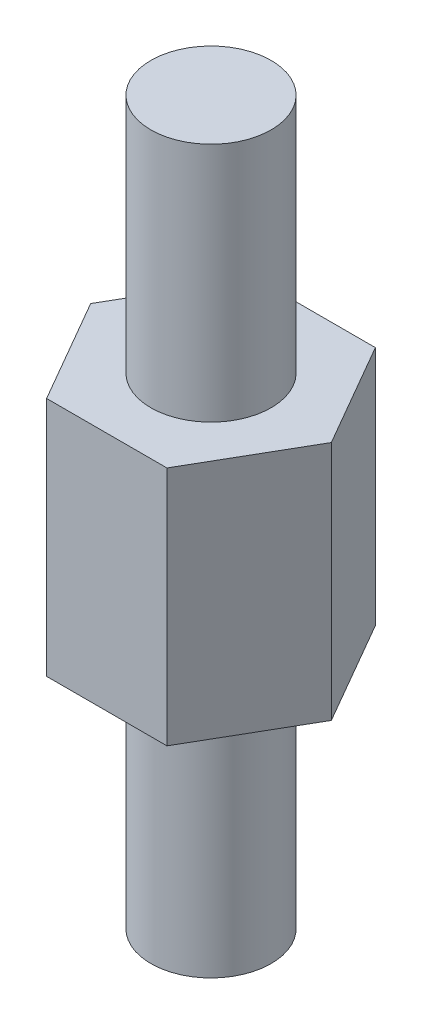
ISO-10303-21;
HEADER;
FILE_DESCRIPTION(('STEP AP214'),'2;1');
FILE_NAME('part.step','',(''),(''),'','','');
FILE_SCHEMA(('AUTOMOTIVE_DESIGN { 1 0 10303 214 1 1 1 1 }'));
ENDSEC;
DATA;
#1=APPLICATION_CONTEXT('core data for automotive mechanical design processes');
#2=APPLICATION_PROTOCOL_DEFINITION('international standard','automotive_design',2000,#1);
#3=PRODUCT_CONTEXT('',#1,'mechanical');
#4=PRODUCT('Part','Part','',(#3));
#5=PRODUCT_RELATED_PRODUCT_CATEGORY('part','',(#4));
#6=PRODUCT_DEFINITION_FORMATION('','',#4);
#7=PRODUCT_DEFINITION_CONTEXT('part definition',#1,'design');
#8=PRODUCT_DEFINITION('design','',#6,#7);
#9=PRODUCT_DEFINITION_SHAPE('','',#8);
#10=(LENGTH_UNIT() NAMED_UNIT(*) SI_UNIT(.MILLI.,.METRE.));
#11=(NAMED_UNIT(*) PLANE_ANGLE_UNIT() SI_UNIT($,.RADIAN.));
#12=(NAMED_UNIT(*) SI_UNIT($,.STERADIAN.) SOLID_ANGLE_UNIT());
#13=UNCERTAINTY_MEASURE_WITH_UNIT(LENGTH_MEASURE(1.E-05),#10,'distance_accuracy_value','');
#14=(GEOMETRIC_REPRESENTATION_CONTEXT(3) GLOBAL_UNCERTAINTY_ASSIGNED_CONTEXT((#13)) GLOBAL_UNIT_ASSIGNED_CONTEXT((#10,
#11,#12)) REPRESENTATION_CONTEXT('',''));
#15=CARTESIAN_POINT('',(0.,0.,0.));
#16=DIRECTION('',(0.,0.,1.));
#17=DIRECTION('',(1.,0.,0.));
#18=AXIS2_PLACEMENT_3D('',#15,#16,#17);
#19=CARTESIAN_POINT('',(1.5,6.,2.59807621135332));
#20=DIRECTION('',(-0.866025403784439,0.,-0.5));
#21=DIRECTION('',(-0.5,0.,0.866025403784439));
#22=AXIS2_PLACEMENT_3D('',#19,#20,#21);
#23=PLANE('',#22);
#24=DIRECTION('',(0.5,0.,-0.866025403784439));
#25=VECTOR('',#24,1.);
#26=CARTESIAN_POINT('',(1.5,0.,2.59807621135332));
#27=LINE('',#26,#25);
#28=CARTESIAN_POINT('',(1.5,0.,2.59807621135332));
#29=VERTEX_POINT('',#28);
#30=CARTESIAN_POINT('',(3.,0.,0.));
#31=VERTEX_POINT('',#30);
#32=EDGE_CURVE('E135',#29,#31,#27,.T.);
#33=ORIENTED_EDGE('',*,*,#32,.T.);
#34=DIRECTION('',(0.,-1.,0.));
#35=VECTOR('',#34,1.);
#36=CARTESIAN_POINT('',(3.,6.,0.));
#37=LINE('',#36,#35);
#38=CARTESIAN_POINT('',(3.,6.,0.));
#39=VERTEX_POINT('',#38);
#40=EDGE_CURVE('E46',#39,#31,#37,.T.);
#41=ORIENTED_EDGE('',*,*,#40,.F.);
#42=DIRECTION('',(0.5,0.,-0.866025403784439));
#43=VECTOR('',#42,1.);
#44=CARTESIAN_POINT('',(1.5,6.,2.59807621135332));
#45=LINE('',#44,#43);
#46=CARTESIAN_POINT('',(1.5,6.,2.59807621135332));
#47=VERTEX_POINT('',#46);
#48=EDGE_CURVE('E152',#47,#39,#45,.T.);
#49=ORIENTED_EDGE('',*,*,#48,.F.);
#50=DIRECTION('',(0.,-1.,0.));
#51=VECTOR('',#50,1.);
#52=CARTESIAN_POINT('',(1.5,6.,2.59807621135332));
#53=LINE('',#52,#51);
#54=EDGE_CURVE('E131',#47,#29,#53,.T.);
#55=ORIENTED_EDGE('',*,*,#54,.T.);
#56=EDGE_LOOP('',(#33,#41,#49,#55));
#57=FACE_BOUND('',#56,.T.);
#58=ADVANCED_FACE('F43',(#57),#23,.F.);
#59=CARTESIAN_POINT('',(3.,6.,0.));
#60=DIRECTION('',(-0.866025403784439,0.,0.5));
#61=DIRECTION('',(0.5,0.,0.866025403784439));
#62=AXIS2_PLACEMENT_3D('',#59,#60,#61);
#63=PLANE('',#62);
#64=DIRECTION('',(-0.5,0.,-0.866025403784439));
#65=VECTOR('',#64,1.);
#66=CARTESIAN_POINT('',(3.,0.,0.));
#67=LINE('',#66,#65);
#68=CARTESIAN_POINT('',(1.5,0.,-2.59807621135332));
#69=VERTEX_POINT('',#68);
#70=EDGE_CURVE('E139',#31,#69,#67,.T.);
#71=ORIENTED_EDGE('',*,*,#70,.T.);
#72=DIRECTION('',(0.,-1.,0.));
#73=VECTOR('',#72,1.);
#74=CARTESIAN_POINT('',(1.5,6.,-2.59807621135332));
#75=LINE('',#74,#73);
#76=CARTESIAN_POINT('',(1.5,6.,-2.59807621135332));
#77=VERTEX_POINT('',#76);
#78=EDGE_CURVE('E158',#77,#69,#75,.T.);
#79=ORIENTED_EDGE('',*,*,#78,.F.);
#80=DIRECTION('',(-0.5,0.,-0.866025403784439));
#81=VECTOR('',#80,1.);
#82=CARTESIAN_POINT('',(3.,6.,0.));
#83=LINE('',#82,#81);
#84=EDGE_CURVE('E100',#39,#77,#83,.T.);
#85=ORIENTED_EDGE('',*,*,#84,.F.);
#86=ORIENTED_EDGE('',*,*,#40,.T.);
#87=EDGE_LOOP('',(#71,#79,#85,#86));
#88=FACE_BOUND('',#87,.T.);
#89=ADVANCED_FACE('F212',(#88),#63,.F.);
#90=CARTESIAN_POINT('',(1.5,6.,-2.59807621135332));
#91=DIRECTION('',(0.,0.,1.));
#92=DIRECTION('',(1.,0.,0.));
#93=AXIS2_PLACEMENT_3D('',#90,#91,#92);
#94=PLANE('',#93);
#95=DIRECTION('',(-1.,0.,0.));
#96=VECTOR('',#95,1.);
#97=CARTESIAN_POINT('',(1.5,0.,-2.59807621135332));
#98=LINE('',#97,#96);
#99=CARTESIAN_POINT('',(-1.5,0.,-2.59807621135332));
#100=VERTEX_POINT('',#99);
#101=EDGE_CURVE('E143',#69,#100,#98,.T.);
#102=ORIENTED_EDGE('',*,*,#101,.T.);
#103=DIRECTION('',(0.,-1.,0.));
#104=VECTOR('',#103,1.);
#105=CARTESIAN_POINT('',(-1.5,6.,-2.59807621135332));
#106=LINE('',#105,#104);
#107=CARTESIAN_POINT('',(-1.5,6.,-2.59807621135332));
#108=VERTEX_POINT('',#107);
#109=EDGE_CURVE('E124',#108,#100,#106,.T.);
#110=ORIENTED_EDGE('',*,*,#109,.F.);
#111=DIRECTION('',(-1.,0.,0.));
#112=VECTOR('',#111,1.);
#113=CARTESIAN_POINT('',(1.5,6.,-2.59807621135332));
#114=LINE('',#113,#112);
#115=EDGE_CURVE('E113',#77,#108,#114,.T.);
#116=ORIENTED_EDGE('',*,*,#115,.F.);
#117=ORIENTED_EDGE('',*,*,#78,.T.);
#118=EDGE_LOOP('',(#102,#110,#116,#117));
#119=FACE_BOUND('',#118,.T.);
#120=ADVANCED_FACE('F216',(#119),#94,.F.);
#121=CARTESIAN_POINT('',(-1.5,6.,-2.59807621135332));
#122=DIRECTION('',(0.866025403784439,0.,0.5));
#123=DIRECTION('',(0.5,0.,-0.866025403784439));
#124=AXIS2_PLACEMENT_3D('',#121,#122,#123);
#125=PLANE('',#124);
#126=DIRECTION('',(-0.5,0.,0.866025403784439));
#127=VECTOR('',#126,1.);
#128=CARTESIAN_POINT('',(-1.5,0.,-2.59807621135332));
#129=LINE('',#128,#127);
#130=CARTESIAN_POINT('',(-3.,0.,0.));
#131=VERTEX_POINT('',#130);
#132=EDGE_CURVE('E122',#100,#131,#129,.T.);
#133=ORIENTED_EDGE('',*,*,#132,.T.);
#134=DIRECTION('',(0.,-1.,0.));
#135=VECTOR('',#134,1.);
#136=CARTESIAN_POINT('',(-3.,6.,0.));
#137=LINE('',#136,#135);
#138=CARTESIAN_POINT('',(-3.,6.,0.));
#139=VERTEX_POINT('',#138);
#140=EDGE_CURVE('E119',#139,#131,#137,.T.);
#141=ORIENTED_EDGE('',*,*,#140,.F.);
#142=DIRECTION('',(-0.5,0.,0.866025403784439));
#143=VECTOR('',#142,1.);
#144=CARTESIAN_POINT('',(-1.5,6.,-2.59807621135332));
#145=LINE('',#144,#143);
#146=EDGE_CURVE('E107',#108,#139,#145,.T.);
#147=ORIENTED_EDGE('',*,*,#146,.F.);
#148=ORIENTED_EDGE('',*,*,#109,.T.);
#149=EDGE_LOOP('',(#133,#141,#147,#148));
#150=FACE_BOUND('',#149,.T.);
#151=ADVANCED_FACE('F120',(#150),#125,.F.);
#152=CARTESIAN_POINT('',(-3.,6.,0.));
#153=DIRECTION('',(0.866025403784438,0.,-0.5));
#154=DIRECTION('',(-0.5,0.,-0.866025403784439));
#155=AXIS2_PLACEMENT_3D('',#152,#153,#154);
#156=PLANE('',#155);
#157=DIRECTION('',(0.5,0.,0.866025403784439));
#158=VECTOR('',#157,1.);
#159=CARTESIAN_POINT('',(-3.,0.,0.));
#160=LINE('',#159,#158);
#161=CARTESIAN_POINT('',(-1.5,0.,2.59807621135332));
#162=VERTEX_POINT('',#161);
#163=EDGE_CURVE('E85',#131,#162,#160,.T.);
#164=ORIENTED_EDGE('',*,*,#163,.T.);
#165=DIRECTION('',(0.,-1.,0.));
#166=VECTOR('',#165,1.);
#167=CARTESIAN_POINT('',(-1.5,6.,2.59807621135332));
#168=LINE('',#167,#166);
#169=CARTESIAN_POINT('',(-1.5,6.,2.59807621135332));
#170=VERTEX_POINT('',#169);
#171=EDGE_CURVE('E125',#170,#162,#168,.T.);
#172=ORIENTED_EDGE('',*,*,#171,.F.);
#173=DIRECTION('',(0.5,0.,0.866025403784439));
#174=VECTOR('',#173,1.);
#175=CARTESIAN_POINT('',(-3.,6.,0.));
#176=LINE('',#175,#174);
#177=EDGE_CURVE('E111',#139,#170,#176,.T.);
#178=ORIENTED_EDGE('',*,*,#177,.F.);
#179=ORIENTED_EDGE('',*,*,#140,.T.);
#180=EDGE_LOOP('',(#164,#172,#178,#179));
#181=FACE_BOUND('',#180,.T.);
#182=ADVANCED_FACE('F127',(#181),#156,.F.);
#183=CARTESIAN_POINT('',(-1.5,6.,2.59807621135332));
#184=DIRECTION('',(0.,0.,-1.));
#185=DIRECTION('',(-1.,0.,0.));
#186=AXIS2_PLACEMENT_3D('',#183,#184,#185);
#187=PLANE('',#186);
#188=DIRECTION('',(1.,0.,0.));
#189=VECTOR('',#188,1.);
#190=CARTESIAN_POINT('',(-1.5,0.,2.59807621135332));
#191=LINE('',#190,#189);
#192=EDGE_CURVE('E91',#162,#29,#191,.T.);
#193=ORIENTED_EDGE('',*,*,#192,.T.);
#194=ORIENTED_EDGE('',*,*,#54,.F.);
#195=DIRECTION('',(1.,0.,0.));
#196=VECTOR('',#195,1.);
#197=CARTESIAN_POINT('',(-1.5,6.,2.59807621135332));
#198=LINE('',#197,#196);
#199=EDGE_CURVE('E62',#170,#47,#198,.T.);
#200=ORIENTED_EDGE('',*,*,#199,.F.);
#201=ORIENTED_EDGE('',*,*,#171,.T.);
#202=EDGE_LOOP('',(#193,#194,#200,#201));
#203=FACE_BOUND('',#202,.T.);
#204=ADVANCED_FACE('F201',(#203),#187,.F.);
#205=CARTESIAN_POINT('',(0.,6.,0.));
#206=DIRECTION('',(0.,1.,0.));
#207=DIRECTION('',(0.,0.,1.));
#208=AXIS2_PLACEMENT_3D('',#205,#206,#207);
#209=PLANE('',#208);
#210=CARTESIAN_POINT('',(0.,6.,0.));
#211=DIRECTION('',(0.,1.,0.));
#212=DIRECTION('',(0.,0.,1.));
#213=AXIS2_PLACEMENT_3D('',#210,#211,#212);
#214=CIRCLE('',#213,1.5);
#215=CARTESIAN_POINT('',(0.,6.,1.5));
#216=VERTEX_POINT('',#215);
#217=EDGE_CURVE('E53',#216,#216,#214,.T.);
#218=ORIENTED_EDGE('',*,*,#217,.F.);
#219=EDGE_LOOP('',(#218));
#220=FACE_BOUND('',#219,.T.);
#221=ORIENTED_EDGE('',*,*,#48,.T.);
#222=ORIENTED_EDGE('',*,*,#84,.T.);
#223=ORIENTED_EDGE('',*,*,#115,.T.);
#224=ORIENTED_EDGE('',*,*,#146,.T.);
#225=ORIENTED_EDGE('',*,*,#177,.T.);
#226=ORIENTED_EDGE('',*,*,#199,.T.);
#227=EDGE_LOOP('',(#221,#222,#223,#224,#225,#226));
#228=FACE_BOUND('',#227,.T.);
#229=ADVANCED_FACE('F109',(#220,#228),#209,.T.);
#230=CARTESIAN_POINT('',(0.,0.,0.));
#231=DIRECTION('',(0.,1.,0.));
#232=DIRECTION('',(0.,0.,1.));
#233=AXIS2_PLACEMENT_3D('',#230,#231,#232);
#234=PLANE('',#233);
#235=CARTESIAN_POINT('',(0.,0.,0.));
#236=DIRECTION('',(0.,-1.,0.));
#237=DIRECTION('',(0.,0.,-1.));
#238=AXIS2_PLACEMENT_3D('',#235,#236,#237);
#239=CIRCLE('',#238,1.5);
#240=CARTESIAN_POINT('',(0.,0.,-1.5));
#241=VERTEX_POINT('',#240);
#242=EDGE_CURVE('E11',#241,#241,#239,.T.);
#243=ORIENTED_EDGE('',*,*,#242,.F.);
#244=EDGE_LOOP('',(#243));
#245=FACE_BOUND('',#244,.T.);
#246=ORIENTED_EDGE('',*,*,#32,.F.);
#247=ORIENTED_EDGE('',*,*,#192,.F.);
#248=ORIENTED_EDGE('',*,*,#163,.F.);
#249=ORIENTED_EDGE('',*,*,#132,.F.);
#250=ORIENTED_EDGE('',*,*,#101,.F.);
#251=ORIENTED_EDGE('',*,*,#70,.F.);
#252=EDGE_LOOP('',(#246,#247,#248,#249,#250,#251));
#253=FACE_BOUND('',#252,.T.);
#254=ADVANCED_FACE('F193',(#245,#253),#234,.F.);
#255=CARTESIAN_POINT('',(0.,12.,0.));
#256=DIRECTION('',(0.,-1.,0.));
#257=DIRECTION('',(0.,0.,-1.));
#258=AXIS2_PLACEMENT_3D('',#255,#256,#257);
#259=CYLINDRICAL_SURFACE('',#258,1.5);
#260=CARTESIAN_POINT('',(0.,12.,0.));
#261=DIRECTION('',(0.,1.,0.));
#262=DIRECTION('',(0.,0.,1.));
#263=AXIS2_PLACEMENT_3D('',#260,#261,#262);
#264=CIRCLE('',#263,1.5);
#265=CARTESIAN_POINT('',(0.,12.,1.5));
#266=VERTEX_POINT('',#265);
#267=EDGE_CURVE('E140',#266,#266,#264,.T.);
#268=ORIENTED_EDGE('',*,*,#267,.F.);
#269=EDGE_LOOP('',(#268));
#270=FACE_BOUND('',#269,.T.);
#271=ORIENTED_EDGE('',*,*,#217,.T.);
#272=EDGE_LOOP('',(#271));
#273=FACE_BOUND('',#272,.T.);
#274=ADVANCED_FACE('F196',(#270,#273),#259,.T.);
#275=CARTESIAN_POINT('',(0.,12.,0.));
#276=DIRECTION('',(0.,1.,0.));
#277=DIRECTION('',(0.,0.,1.));
#278=AXIS2_PLACEMENT_3D('',#275,#276,#277);
#279=PLANE('',#278);
#280=ORIENTED_EDGE('',*,*,#267,.T.);
#281=EDGE_LOOP('',(#280));
#282=FACE_BOUND('',#281,.T.);
#283=ADVANCED_FACE('F189',(#282),#279,.T.);
#284=CARTESIAN_POINT('',(0.,-6.,0.));
#285=DIRECTION('',(0.,1.,0.));
#286=DIRECTION('',(0.,0.,1.));
#287=AXIS2_PLACEMENT_3D('',#284,#285,#286);
#288=CYLINDRICAL_SURFACE('',#287,1.5);
#289=CARTESIAN_POINT('',(0.,-6.,0.));
#290=DIRECTION('',(0.,-1.,0.));
#291=DIRECTION('',(0.,0.,-1.));
#292=AXIS2_PLACEMENT_3D('',#289,#290,#291);
#293=CIRCLE('',#292,1.5);
#294=CARTESIAN_POINT('',(0.,-6.,-1.5));
#295=VERTEX_POINT('',#294);
#296=EDGE_CURVE('E179',#295,#295,#293,.T.);
#297=ORIENTED_EDGE('',*,*,#296,.F.);
#298=EDGE_LOOP('',(#297));
#299=FACE_BOUND('',#298,.T.);
#300=ORIENTED_EDGE('',*,*,#242,.T.);
#301=EDGE_LOOP('',(#300));
#302=FACE_BOUND('',#301,.T.);
#303=ADVANCED_FACE('F186',(#299,#302),#288,.T.);
#304=CARTESIAN_POINT('',(0.,-6.,0.));
#305=DIRECTION('',(0.,-1.,0.));
#306=DIRECTION('',(0.,0.,-1.));
#307=AXIS2_PLACEMENT_3D('',#304,#305,#306);
#308=PLANE('',#307);
#309=ORIENTED_EDGE('',*,*,#296,.T.);
#310=EDGE_LOOP('',(#309));
#311=FACE_BOUND('',#310,.T.);
#312=ADVANCED_FACE('F184',(#311),#308,.T.);
#313=CLOSED_SHELL('',(#58,#89,#120,#151,#182,#204,#229,#254,#274,#283,#303,#312));
#314=MANIFOLD_SOLID_BREP('B2',#313);
#315=ADVANCED_BREP_SHAPE_REPRESENTATION('',(#18,#314),#14);
#316=SHAPE_DEFINITION_REPRESENTATION(#9,#315);
ENDSEC;
END-ISO-10303-21;
